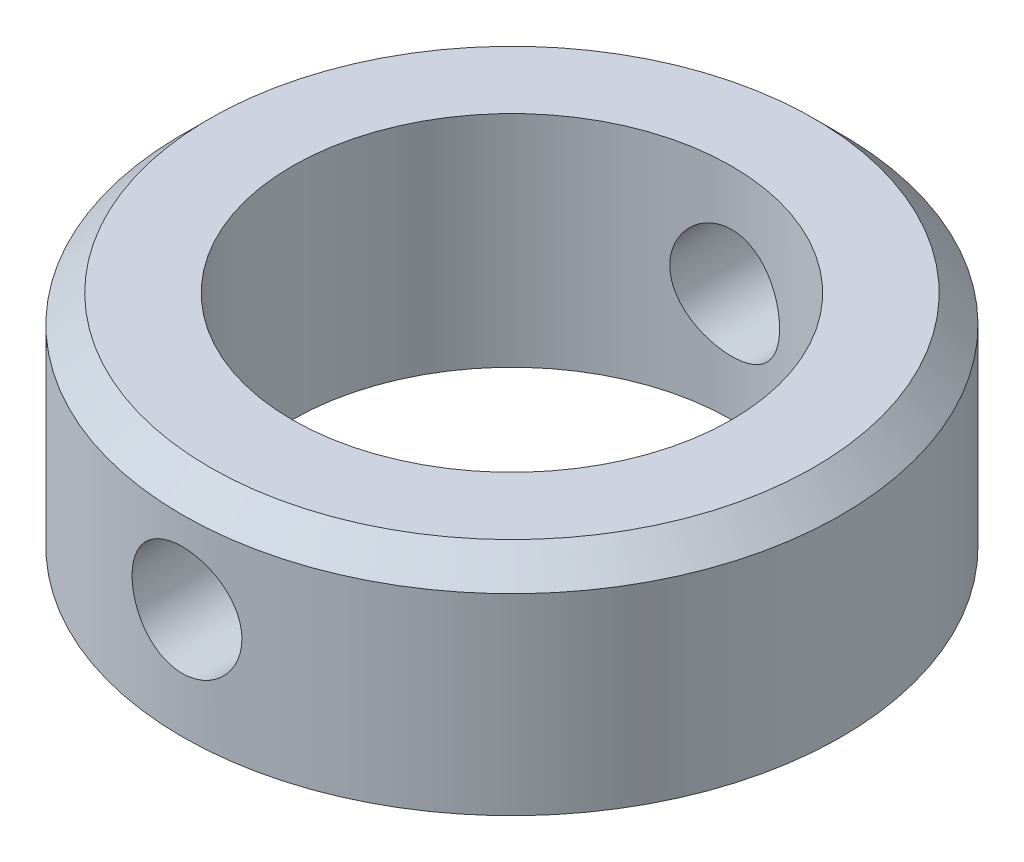
ISO-10303-21;
HEADER;
FILE_DESCRIPTION(('STEP AP214'),'2;1');
FILE_NAME('part.step','',(''),(''),'','','');
FILE_SCHEMA(('AUTOMOTIVE_DESIGN { 1 0 10303 214 1 1 1 1 }'));
ENDSEC;
DATA;
#1=APPLICATION_CONTEXT('core data for automotive mechanical design processes');
#2=APPLICATION_PROTOCOL_DEFINITION('international standard','automotive_design',2000,#1);
#3=PRODUCT_CONTEXT('',#1,'mechanical');
#4=PRODUCT('Part','Part','',(#3));
#5=PRODUCT_RELATED_PRODUCT_CATEGORY('part','',(#4));
#6=PRODUCT_DEFINITION_FORMATION('','',#4);
#7=PRODUCT_DEFINITION_CONTEXT('part definition',#1,'design');
#8=PRODUCT_DEFINITION('design','',#6,#7);
#9=PRODUCT_DEFINITION_SHAPE('','',#8);
#10=(LENGTH_UNIT() NAMED_UNIT(*) SI_UNIT(.MILLI.,.METRE.));
#11=(NAMED_UNIT(*) PLANE_ANGLE_UNIT() SI_UNIT($,.RADIAN.));
#12=(NAMED_UNIT(*) SI_UNIT($,.STERADIAN.) SOLID_ANGLE_UNIT());
#13=UNCERTAINTY_MEASURE_WITH_UNIT(LENGTH_MEASURE(1.E-05),#10,'distance_accuracy_value','');
#14=(GEOMETRIC_REPRESENTATION_CONTEXT(3) GLOBAL_UNCERTAINTY_ASSIGNED_CONTEXT((#13)) GLOBAL_UNIT_ASSIGNED_CONTEXT((#10,
#11,#12)) REPRESENTATION_CONTEXT('',''));
#15=CARTESIAN_POINT('',(0.,0.,0.));
#16=DIRECTION('',(0.,0.,1.));
#17=DIRECTION('',(1.,0.,0.));
#18=AXIS2_PLACEMENT_3D('',#15,#16,#17);
#19=CARTESIAN_POINT('',(0.,4.,0.));
#20=DIRECTION('',(0.,1.,0.));
#21=DIRECTION('',(0.,0.,1.));
#22=AXIS2_PLACEMENT_3D('',#19,#20,#21);
#23=PLANE('',#22);
#24=CARTESIAN_POINT('',(0.,4.,0.));
#25=DIRECTION('',(0.,1.,0.));
#26=DIRECTION('',(0.,0.,1.));
#27=AXIS2_PLACEMENT_3D('',#24,#25,#26);
#28=CIRCLE('',#27,11.);
#29=CARTESIAN_POINT('',(0.,4.,11.));
#30=VERTEX_POINT('',#29);
#31=EDGE_CURVE('E50',#30,#30,#28,.T.);
#32=ORIENTED_EDGE('',*,*,#31,.T.);
#33=EDGE_LOOP('',(#32));
#34=FACE_BOUND('',#33,.T.);
#35=CARTESIAN_POINT('',(0.,4.,0.));
#36=DIRECTION('',(0.,1.,0.));
#37=DIRECTION('',(0.,0.,1.));
#38=AXIS2_PLACEMENT_3D('',#35,#36,#37);
#39=CIRCLE('',#38,8.);
#40=CARTESIAN_POINT('',(0.,4.,8.));
#41=VERTEX_POINT('',#40);
#42=EDGE_CURVE('E54',#41,#41,#39,.T.);
#43=ORIENTED_EDGE('',*,*,#42,.F.);
#44=EDGE_LOOP('',(#43));
#45=FACE_BOUND('',#44,.T.);
#46=ADVANCED_FACE('F39',(#34,#45),#23,.T.);
#47=CARTESIAN_POINT('',(0.,-4.,0.));
#48=DIRECTION('',(0.,1.,0.));
#49=DIRECTION('',(0.,0.,1.));
#50=AXIS2_PLACEMENT_3D('',#47,#48,#49);
#51=PLANE('',#50);
#52=CARTESIAN_POINT('',(0.,-4.,0.));
#53=DIRECTION('',(0.,1.,0.));
#54=DIRECTION('',(0.,0.,1.));
#55=AXIS2_PLACEMENT_3D('',#52,#53,#54);
#56=CIRCLE('',#55,12.);
#57=CARTESIAN_POINT('',(0.,-4.,12.));
#58=VERTEX_POINT('',#57);
#59=EDGE_CURVE('E51',#58,#58,#56,.T.);
#60=ORIENTED_EDGE('',*,*,#59,.F.);
#61=EDGE_LOOP('',(#60));
#62=FACE_BOUND('',#61,.T.);
#63=CARTESIAN_POINT('',(0.,-4.,0.));
#64=DIRECTION('',(0.,1.,0.));
#65=DIRECTION('',(0.,0.,1.));
#66=AXIS2_PLACEMENT_3D('',#63,#64,#65);
#67=CIRCLE('',#66,8.);
#68=CARTESIAN_POINT('',(0.,-4.,8.));
#69=VERTEX_POINT('',#68);
#70=EDGE_CURVE('E107',#69,#69,#67,.T.);
#71=ORIENTED_EDGE('',*,*,#70,.T.);
#72=EDGE_LOOP('',(#71));
#73=FACE_BOUND('',#72,.T.);
#74=ADVANCED_FACE('F100',(#62,#73),#51,.F.);
#75=CARTESIAN_POINT('',(0.,4.,0.));
#76=DIRECTION('',(0.,-1.,0.));
#77=DIRECTION('',(0.,0.,-1.));
#78=AXIS2_PLACEMENT_3D('',#75,#76,#77);
#79=CYLINDRICAL_SURFACE('',#78,12.);
#80=CARTESIAN_POINT('',(0.,2.99999999999999,0.));
#81=DIRECTION('',(0.,1.,0.));
#82=DIRECTION('',(0.,0.,1.));
#83=AXIS2_PLACEMENT_3D('',#80,#81,#82);
#84=CIRCLE('',#83,12.);
#85=CARTESIAN_POINT('',(0.,2.99999999999999,12.));
#86=VERTEX_POINT('',#85);
#87=EDGE_CURVE('E10',#86,#86,#84,.F.);
#88=ORIENTED_EDGE('',*,*,#87,.T.);
#89=EDGE_LOOP('',(#88));
#90=FACE_BOUND('',#89,.T.);
#91=CARTESIAN_POINT('',(0.,2.,-12.));
#92=CARTESIAN_POINT('',(-0.111512723966572,1.99999552884175,-11.9999980893506));
#93=CARTESIAN_POINT('',(-0.223086305471057,1.99064218002486,-11.9984294233043));
#94=CARTESIAN_POINT('',(-0.443104177338434,1.95349147298774,-11.9923227595311));
#95=CARTESIAN_POINT('',(-0.551545494367397,1.92567715447072,-11.9877820313911));
#96=CARTESIAN_POINT('',(-0.762083797770115,1.8524676411258,-11.9762405458916));
#97=CARTESIAN_POINT('',(-0.86418589474552,1.80708682748754,-11.9692418012735));
#98=CARTESIAN_POINT('',(-1.05931347358236,1.70007016635808,-11.9535538166566));
#99=CARTESIAN_POINT('',(-1.15233999190287,1.6384361780136,-11.9448647700355));
#100=CARTESIAN_POINT('',(-1.32757809143334,1.50003593294363,-11.9266665396665));
#101=CARTESIAN_POINT('',(-1.40969032282797,1.4231447082911,-11.9171509745189));
#102=CARTESIAN_POINT('',(-1.55991079892794,1.25668162522175,-11.8984210150139));
#103=CARTESIAN_POINT('',(-1.62801815951278,1.16710896683471,-11.8892066397013));
#104=CARTESIAN_POINT('',(-1.74869370048411,0.977143227042356,-11.8720605260782));
#105=CARTESIAN_POINT('',(-1.8011636422888,0.876686930556196,-11.8641370327331));
#106=CARTESIAN_POINT('',(-1.88844669232898,0.6682323485595,-11.8505583183574));
#107=CARTESIAN_POINT('',(-1.92326099325249,0.560234573057895,-11.8449029441145));
#108=CARTESIAN_POINT('',(-1.97393150222785,0.340815780114769,-11.836564294742));
#109=CARTESIAN_POINT('',(-1.98995922330832,0.229435410798887,-11.8338541478856));
#110=CARTESIAN_POINT('',(-2.0031333802319,0.00553577849322356,-11.8316315114932));
#111=CARTESIAN_POINT('',(-2.0002811523112,-0.106983403333839,-11.8321187956577));
#112=CARTESIAN_POINT('',(-1.97591607871692,-0.328742289020358,-11.8362114309084));
#113=CARTESIAN_POINT('',(-1.95459590551182,-0.438003842836186,-11.8397845865513));
#114=CARTESIAN_POINT('',(-1.89420251232276,-0.651377054263306,-11.8495959616881));
#115=CARTESIAN_POINT('',(-1.85512868345579,-0.755488535110836,-11.8558342725862));
#116=CARTESIAN_POINT('',(-1.76014179687513,-0.956183058752735,-11.8703078346728));
#117=CARTESIAN_POINT('',(-1.70414873110377,-1.05272752486498,-11.8785525368586));
#118=CARTESIAN_POINT('',(-1.57696961404595,-1.23512352043071,-11.8961033473201));
#119=CARTESIAN_POINT('',(-1.50578233652343,-1.32097418596394,-11.9054095412343));
#120=CARTESIAN_POINT('',(-1.34918576972724,-1.48066086864588,-11.9241762230383));
#121=CARTESIAN_POINT('',(-1.2636111710985,-1.55433481483207,-11.9336371938532));
#122=CARTESIAN_POINT('',(-1.08122819918532,-1.68630221013227,-11.9515408111738));
#123=CARTESIAN_POINT('',(-0.984419753525138,-1.74459556014658,-11.959983451118));
#124=CARTESIAN_POINT('',(-0.78216473293337,-1.84416178170903,-11.9749111431433));
#125=CARTESIAN_POINT('',(-0.67671098045173,-1.885420335465,-11.9813945472596));
#126=CARTESIAN_POINT('',(-0.460238676482186,-1.94959537219678,-11.9916600241013));
#127=CARTESIAN_POINT('',(-0.349220591343575,-1.97251338957897,-11.9954423228038));
#128=CARTESIAN_POINT('',(-0.1261679210413,-1.99913708676891,-11.9998490387415));
#129=CARTESIAN_POINT('',(-0.0141605897208095,-2.00306525744449,-12.0005100241023));
#130=CARTESIAN_POINT('',(0.20891181831191,-1.9921909244575,-11.9986997953694));
#131=CARTESIAN_POINT('',(0.31997693111363,-1.97738914149301,-11.9962287017929));
#132=CARTESIAN_POINT('',(0.53732494043741,-1.92966012053162,-11.9884546155056));
#133=CARTESIAN_POINT('',(0.643632694708303,-1.8968430332879,-11.9831688384105));
#134=CARTESIAN_POINT('',(0.849237507888353,-1.81413238544037,-11.9703557156429));
#135=CARTESIAN_POINT('',(0.948534172727774,-1.76423786589178,-11.9628282440962));
#136=CARTESIAN_POINT('',(1.13826455157517,-1.64827910024257,-11.9462761304193));
#137=CARTESIAN_POINT('',(1.22861220074972,-1.5820758750662,-11.9372388470962));
#138=CARTESIAN_POINT('',(1.39699486840215,-1.43557014769195,-11.9187077391352));
#139=CARTESIAN_POINT('',(1.47502899175727,-1.35526662137867,-11.9092138813724));
#140=CARTESIAN_POINT('',(1.6173942237264,-1.18184196154286,-11.8907214018868));
#141=CARTESIAN_POINT('',(1.68157500889097,-1.08859666758847,-11.8817289290968));
#142=CARTESIAN_POINT('',(1.79336184823599,-0.89251762468917,-11.8653722382231));
#143=CARTESIAN_POINT('',(1.84096842781586,-0.789684179818004,-11.8580079685282));
#144=CARTESIAN_POINT('',(1.91803066517852,-0.577768213750295,-11.8457876295816));
#145=CARTESIAN_POINT('',(1.94756114603836,-0.46871352397561,-11.8409212344885));
#146=CARTESIAN_POINT('',(1.98786836302262,-0.247103896622591,-11.8342217346821));
#147=CARTESIAN_POINT('',(1.99864672955693,-0.134549264214359,-11.8323883662618));
#148=CARTESIAN_POINT('',(2.00109829283788,0.0893641327699265,-11.8319738646721));
#149=CARTESIAN_POINT('',(1.99300810890015,0.20072030286023,-11.8333524520452));
#150=CARTESIAN_POINT('',(1.95846387116548,0.420463398440611,-11.8391182516298));
#151=CARTESIAN_POINT('',(1.93200987688998,0.528850333553497,-11.8435054540897));
#152=CARTESIAN_POINT('',(1.86157959167592,0.73948674983409,-11.8547788502538));
#153=CARTESIAN_POINT('',(1.81762367248035,0.841743208044819,-11.8616621377574));
#154=CARTESIAN_POINT('',(1.71346160313273,1.03746853535588,-11.8771549513777));
#155=CARTESIAN_POINT('',(1.65325464699885,1.13093696829771,-11.8857645631072));
#156=CARTESIAN_POINT('',(1.51745510749772,1.3076284664862,-11.903867632365));
#157=CARTESIAN_POINT('',(1.44168845087492,1.39071681336022,-11.9133703646104));
#158=CARTESIAN_POINT('',(1.27728722510418,1.54308128357995,-11.9321149788867));
#159=CARTESIAN_POINT('',(1.18864969033011,1.61235421491054,-11.9413568002124));
#160=CARTESIAN_POINT('',(1.00029533571223,1.73555861455996,-11.9586122371378));
#161=CARTESIAN_POINT('',(0.900506230026255,1.78938083145036,-11.9666169300248));
#162=CARTESIAN_POINT('',(0.693210455503185,1.87941558768794,-11.9804093408142));
#163=CARTESIAN_POINT('',(0.585711595864008,1.91564566486376,-11.9861992654199));
#164=CARTESIAN_POINT('',(0.398162648036321,1.96160421930133,-11.9936463266636));
#165=CARTESIAN_POINT('',(0.319247064238758,1.97597957569277,-11.9960162181869));
#166=CARTESIAN_POINT('',(0.160231448255847,1.9951789902758,-11.999193727889));
#167=CARTESIAN_POINT('',(0.0801314364867953,2.00000321290989,-12.0000013729651));
#168=CARTESIAN_POINT('',(0.,2.,-12.));
#169=B_SPLINE_CURVE_WITH_KNOTS('',3,(#91,#92,#93,#94,#95,#96,#97,#98,#99,#100,#101,#102,#103,
#104,#105,#106,#107,#108,#109,#110,#111,#112,#113,#114,#115,#116,#117,#118,#119,#120,#121,#122,
#123,#124,#125,#126,#127,#128,#129,#130,#131,#132,#133,#134,#135,#136,#137,#138,#139,#140,#141,
#142,#143,#144,#145,#146,#147,#148,#149,#150,#151,#152,#153,#154,#155,#156,#157,#158,#159,#160,
#161,#162,#163,#164,#165,#166,#167,#168),.UNSPECIFIED.,.T.,.F.,(4,2,2,2,2,2,2,2,2,2,2,2,2,2,2,2,
2,2,2,2,2,2,2,2,2,2,2,2,2,2,2,2,2,2,2,2,2,2,4),(0.,0.334245267950808,0.668798036556336,
1.00307749362022,1.33731873013983,1.67441992849866,2.01154240135885,2.35074016659072,
2.68991501500945,3.02596861682739,3.36199843456709,3.69456417408327,4.02714132020305,
4.36131645306046,4.69551856544459,5.03386215929061,5.37220793308678,5.71083751132722,
6.04943875616919,6.38406306793118,6.71867450428688,7.05126245605132,7.38386908660853,
7.71941460501619,8.05498450443426,8.39403057606095,8.73306589900754,9.07068817873417,
9.40828110229294,9.7416632761816,10.0750443695051,10.4080385458098,10.7410492402347,
11.0780110735471,11.4150506710318,11.7544178528576,12.0934460170406,12.3336339853121,
12.5738178182157),.UNSPECIFIED.);
#170=CARTESIAN_POINT('',(0.,2.,-12.));
#171=VERTEX_POINT('',#170);
#172=EDGE_CURVE('E86',#171,#171,#169,.T.);
#173=ORIENTED_EDGE('',*,*,#172,.T.);
#174=EDGE_LOOP('',(#173));
#175=FACE_BOUND('',#174,.T.);
#176=CARTESIAN_POINT('',(2.,0.,11.8321595661992));
#177=CARTESIAN_POINT('',(1.99999551873586,-0.111500598529449,11.8321615789328));
#178=CARTESIAN_POINT('',(1.99064413522263,-0.223062084857177,11.8337527390819));
#179=CARTESIAN_POINT('',(1.9535019424531,-0.443054834610535,11.8399396576003));
#180=CARTESIAN_POINT('',(1.92569412824689,-0.551483115006451,11.844538186771));
#181=CARTESIAN_POINT('',(1.8525036349364,-0.761993826673285,11.8562048749385));
#182=CARTESIAN_POINT('',(1.80713564394559,-0.864081478929796,11.8632709694721));
#183=CARTESIAN_POINT('',(1.70014919751157,-1.05918476377422,11.8790741768183));
#184=CARTESIAN_POINT('',(1.63853257080106,-1.15220141566186,11.8878111015538));
#185=CARTESIAN_POINT('',(1.50015002157324,-1.32745027979565,11.906067769247));
#186=CARTESIAN_POINT('',(1.42325523914587,-1.40958010510897,11.9155937386236));
#187=CARTESIAN_POINT('',(1.25677760375622,-1.55983464548945,11.9342998453486));
#188=CARTESIAN_POINT('',(1.16719399931998,-1.62795853049233,11.9434799621739));
#189=CARTESIAN_POINT('',(0.977218295958686,-1.74865165377542,11.9605258958617));
#190=CARTESIAN_POINT('',(0.876764865165368,-1.80112560618544,11.9683835394587));
#191=CARTESIAN_POINT('',(0.668316497379096,-1.88841685642444,11.9818298956567));
#192=CARTESIAN_POINT('',(0.560322051262552,-1.9232353023079,11.9874187557813));
#193=CARTESIAN_POINT('',(0.340914981075395,-1.97391402798712,11.9956538777952));
#194=CARTESIAN_POINT('',(0.229543109343418,-1.98994633280375,11.9983268248873));
#195=CARTESIAN_POINT('',(0.00566022842063891,-2.00313260332208,12.0005206347422));
#196=CARTESIAN_POINT('',(-0.106850702823118,-2.00028785219779,12.0000417117545));
#197=CARTESIAN_POINT('',(-0.328641748063099,-1.97593491877743,11.9960068674511));
#198=CARTESIAN_POINT('',(-0.437942824560112,-1.95461186927268,11.9924814695392));
#199=CARTESIAN_POINT('',(-0.651393583689432,-1.89419914060281,11.9827838301731));
#200=CARTESIAN_POINT('',(-0.755543109321202,-1.8551089203284,11.9766115081057));
#201=CARTESIAN_POINT('',(-0.956284918226117,-1.76008748774775,11.9622615880957));
#202=CARTESIAN_POINT('',(-1.05284041841524,-1.70407999033405,11.954074938615));
#203=CARTESIAN_POINT('',(-1.23525242387731,-1.57686974189196,11.936605904572));
#204=CARTESIAN_POINT('',(-1.3211080623327,-1.50566576103135,11.9273234313531));
#205=CARTESIAN_POINT('',(-1.48077701875733,-1.34905695470456,11.9085621458608));
#206=CARTESIAN_POINT('',(-1.55443160180257,-1.26349032407921,11.8990823178483));
#207=CARTESIAN_POINT('',(-1.68636367075845,-1.08113032782735,11.8811036782784));
#208=CARTESIAN_POINT('',(-1.74464101482593,-0.984336858653745,11.8726048757706));
#209=CARTESIAN_POINT('',(-1.84419554759063,-0.782086686498017,11.8575500364945));
#210=CARTESIAN_POINT('',(-1.88545362182339,-0.676620401526329,11.8509961864208));
#211=CARTESIAN_POINT('',(-1.94962389665249,-0.460120742153966,11.840609509519));
#212=CARTESIAN_POINT('',(-1.97253771261436,-0.349087858854063,11.8367764431066));
#213=CARTESIAN_POINT('',(-1.99914550790341,-0.126027075070297,11.8323116753769));
#214=CARTESIAN_POINT('',(-2.00306576632995,-0.0140268962383203,11.8316422860694));
#215=CARTESIAN_POINT('',(-1.99217816214597,0.209029337352654,11.8334802782589));
#216=CARTESIAN_POINT('',(-1.97737102289973,0.320085428411176,11.8359875370548));
#217=CARTESIAN_POINT('',(-1.92964186794248,0.537382207352685,11.8438614996401));
#218=CARTESIAN_POINT('',(-1.89683503251711,0.643648911902407,11.8492100153468));
#219=CARTESIAN_POINT('',(-1.81415855215382,0.849176133023587,11.862148584044));
#220=CARTESIAN_POINT('',(-1.76428788648075,0.948436230040719,11.8697387711246));
#221=CARTESIAN_POINT('',(-1.64836533858338,1.13813967552489,11.8863930271791));
#222=CARTESIAN_POINT('',(-1.58216845132749,1.22849325820484,11.8954700448028));
#223=CARTESIAN_POINT('',(-1.43567157256639,1.396890826156,11.9140373334389));
#224=CARTESIAN_POINT('',(-1.35537058910724,1.47493394488779,11.9235276334827));
#225=CARTESIAN_POINT('',(-1.18194245626305,1.61732151418296,11.9419713769461));
#226=CARTESIAN_POINT('',(-1.08869060270896,1.68151506102763,11.9509182107574));
#227=CARTESIAN_POINT('',(-0.892594758359462,1.7933242616039,11.9671608994635));
#228=CARTESIAN_POINT('',(-0.789751077976503,1.84094045157908,11.9744568077598));
#229=CARTESIAN_POINT('',(-0.577839241201065,1.91800846716389,11.9865468653567));
#230=CARTESIAN_POINT('',(-0.468800450082091,1.94753926058794,11.9913518765409));
#231=CARTESIAN_POINT('',(-0.247224587899371,1.98785247917106,11.9979646653543));
#232=CARTESIAN_POINT('',(-0.134687805457299,1.99863644698588,11.9997726896015));
#233=CARTESIAN_POINT('',(0.0892330206189387,2.00110550584976,12.0001843031025));
#234=CARTESIAN_POINT('',(0.200614528482129,1.99302020315287,11.9988264161935));
#235=CARTESIAN_POINT('',(0.420409579451761,1.95847686218446,11.9931374270987));
#236=CARTESIAN_POINT('',(0.528823139173981,1.93201892679226,11.9888063415615));
#237=CARTESIAN_POINT('',(0.739517156734828,1.86156946756508,11.9776559106192));
#238=CARTESIAN_POINT('',(0.841804297723055,1.81759746543196,11.970839336327));
#239=CARTESIAN_POINT('',(1.03758436238573,1.71339365101554,11.9554620550242));
#240=CARTESIAN_POINT('',(1.13107686889457,1.65316106795004,11.9469012653393));
#241=CARTESIAN_POINT('',(1.30777035642111,1.5173319260316,11.9288610369313));
#242=CARTESIAN_POINT('',(1.3908411444822,1.441567236199,11.919372196329));
#243=CARTESIAN_POINT('',(1.54317110076073,1.27717735367695,11.900610426515));
#244=CARTESIAN_POINT('',(1.61242702936952,1.18854915286998,11.8913375483961));
#245=CARTESIAN_POINT('',(1.73561141672869,1.00020374200831,11.8739867482713));
#246=CARTESIAN_POINT('',(1.78942799124616,0.900412528187613,11.8659177427663));
#247=CARTESIAN_POINT('',(1.87945162912342,0.693112611329485,11.8519936807305));
#248=CARTESIAN_POINT('',(1.91567628417846,0.58561174185811,11.846136413799));
#249=CARTESIAN_POINT('',(1.96162084250194,0.398076984410094,11.8385979588519));
#250=CARTESIAN_POINT('',(1.97598993413711,0.319178553629915,11.8361969873557));
#251=CARTESIAN_POINT('',(1.99518103614505,0.160197212130451,11.8329770823046));
#252=CARTESIAN_POINT('',(2.00000321983422,0.0801143229406412,11.8321581200295));
#253=CARTESIAN_POINT('',(2.,0.,11.8321595661992));
#254=B_SPLINE_CURVE_WITH_KNOTS('',3,(#176,#177,#178,#179,#180,#181,#182,#183,#184,#185,#186,
#187,#188,#189,#190,#191,#192,#193,#194,#195,#196,#197,#198,#199,#200,#201,#202,#203,#204,#205,
#206,#207,#208,#209,#210,#211,#212,#213,#214,#215,#216,#217,#218,#219,#220,#221,#222,#223,#224,
#225,#226,#227,#228,#229,#230,#231,#232,#233,#234,#235,#236,#237,#238,#239,#240,#241,#242,#243,
#244,#245,#246,#247,#248,#249,#250,#251,#252,#253),.UNSPECIFIED.,.T.,.F.,(4,2,2,2,2,2,2,2,2,2,2,
2,2,2,2,2,2,2,2,2,2,2,2,2,2,2,2,2,2,2,2,2,2,2,2,2,2,2,4),(0.,0.334208831142192,
0.668726015970375,1.00296399830015,1.33716437924219,1.67431327324572,2.01148214267557,
2.35066384089148,2.6898234808889,3.02585253978052,3.36185875722153,3.69453696931735,
4.02722531399626,4.3614368331154,4.69567540981411,5.03396898769698,5.37226568596815,
5.71094129998882,6.04958708750461,6.38418833936328,6.71877666731181,7.05124851708393,
7.38374025834859,7.71929874210161,8.05488083544551,8.39395290428305,8.73301400381358,
9.07058387534116,9.4081259672988,9.74158221012733,10.0750365857506,10.4081203186597,
10.7412198431387,11.078135979706,11.4151310310545,11.7545098209466,12.0935485339556,
12.3336853643501,12.5738178352145),.UNSPECIFIED.);
#255=CARTESIAN_POINT('',(2.,0.,11.8321595661992));
#256=VERTEX_POINT('',#255);
#257=EDGE_CURVE('E66',#256,#256,#254,.T.);
#258=ORIENTED_EDGE('',*,*,#257,.T.);
#259=EDGE_LOOP('',(#258));
#260=FACE_BOUND('',#259,.T.);
#261=ORIENTED_EDGE('',*,*,#59,.T.);
#262=EDGE_LOOP('',(#261));
#263=FACE_BOUND('',#262,.T.);
#264=ADVANCED_FACE('F91',(#90,#175,#260,#263),#79,.T.);
#265=CARTESIAN_POINT('',(0.,4.,0.));
#266=DIRECTION('',(0.,-1.,0.));
#267=DIRECTION('',(0.,0.,-1.));
#268=AXIS2_PLACEMENT_3D('',#265,#266,#267);
#269=CYLINDRICAL_SURFACE('',#268,8.);
#270=CARTESIAN_POINT('',(0.,2.,-8.));
#271=CARTESIAN_POINT('',(-0.110501451559641,1.99999689901579,-7.9999981315735));
#272=CARTESIAN_POINT('',(-0.221037543774351,1.99081126563495,-7.99768770842435));
#273=CARTESIAN_POINT('',(-0.438941765027377,1.95436646492399,-7.98869485106526));
#274=CARTESIAN_POINT('',(-0.546308062494319,1.92709705394953,-7.98200993893301));
#275=CARTESIAN_POINT('',(-0.754694496243435,1.85541432871722,-7.96500835109376));
#276=CARTESIAN_POINT('',(-0.855722084573335,1.81102160171297,-7.95469603789411));
#277=CARTESIAN_POINT('',(-1.04889617587257,1.70642481327354,-7.93153791743495));
#278=CARTESIAN_POINT('',(-1.14104237913168,1.64622021850804,-7.91869202472209));
#279=CARTESIAN_POINT('',(-1.31573590306789,1.51039894712776,-7.89156551455591));
#280=CARTESIAN_POINT('',(-1.39807425341474,1.43451790005459,-7.87726276197502));
#281=CARTESIAN_POINT('',(-1.54899856960443,1.27006372678795,-7.84898160157248));
#282=CARTESIAN_POINT('',(-1.61758298259892,1.18148916940409,-7.83500323053157));
#283=CARTESIAN_POINT('',(-1.74003539039863,0.992539697684013,-7.80873034264225));
#284=CARTESIAN_POINT('',(-1.79366962123352,0.892009025588362,-7.79646392619748));
#285=CARTESIAN_POINT('',(-1.88319587806766,0.68300211778662,-7.77532659757355));
#286=CARTESIAN_POINT('',(-1.91909074058685,0.574527155557314,-7.76645514259225));
#287=CARTESIAN_POINT('',(-1.97140644907302,0.355008669064455,-7.7533396892843));
#288=CARTESIAN_POINT('',(-1.98820302444274,0.244060138616012,-7.74900654662681));
#289=CARTESIAN_POINT('',(-2.00301570008854,0.0208419080008738,-7.74519149946122));
#290=CARTESIAN_POINT('',(-2.00103485575748,-0.0914275742561817,-7.74570880570571));
#291=CARTESIAN_POINT('',(-1.97864869951961,-0.311221076993803,-7.75145607355756));
#292=CARTESIAN_POINT('',(-1.95869112025418,-0.418794161953773,-7.75657150676392));
#293=CARTESIAN_POINT('',(-1.90163224920399,-0.629014734548077,-7.77075612894759));
#294=CARTESIAN_POINT('',(-1.86452973609252,-0.731661870705227,-7.77982559958985));
#295=CARTESIAN_POINT('',(-1.77385263724958,-0.930317355002839,-7.80100151874212));
#296=CARTESIAN_POINT('',(-1.72011555631056,-1.02624822905276,-7.81313769959755));
#297=CARTESIAN_POINT('',(-1.59780836801993,-1.20789161300909,-7.83906281127988));
#298=CARTESIAN_POINT('',(-1.52923566507845,-1.29360233075633,-7.85285203112837));
#299=CARTESIAN_POINT('',(-1.37688456624163,-1.45493815425921,-7.88101174053188));
#300=CARTESIAN_POINT('',(-1.29272834422115,-1.53020598674847,-7.89538759304001));
#301=CARTESIAN_POINT('',(-1.11281589000493,-1.6656283232852,-7.92274620771675));
#302=CARTESIAN_POINT('',(-1.01705930361059,-1.72578236568475,-7.93572892732543));
#303=CARTESIAN_POINT('',(-0.816154518241856,-1.82940078163251,-7.9589030945892));
#304=CARTESIAN_POINT('',(-0.710975190944832,-1.87280712033924,-7.96908480170303));
#305=CARTESIAN_POINT('',(-0.494501344190511,-1.94122307427943,-7.98543889321888));
#306=CARTESIAN_POINT('',(-0.383207998867313,-1.96623620855752,-7.99161204452374));
#307=CARTESIAN_POINT('',(-0.160719960520037,-1.99661008741178,-7.999139990285));
#308=CARTESIAN_POINT('',(-0.0495956266509474,-2.0024573681004,-8.00061404677705));
#309=CARTESIAN_POINT('',(0.172043833068676,-1.99566799725935,-7.99891739752601));
#310=CARTESIAN_POINT('',(0.282559012859459,-1.98303300960116,-7.99574710989128));
#311=CARTESIAN_POINT('',(0.498152358368655,-1.94003878881149,-7.98519441503143));
#312=CARTESIAN_POINT('',(0.603286825291672,-1.90994498203068,-7.97787512247748));
#313=CARTESIAN_POINT('',(0.807009723270014,-1.83319055462874,-7.95984942178845));
#314=CARTESIAN_POINT('',(0.905597492043512,-1.78652826091577,-7.94914267159856));
#315=CARTESIAN_POINT('',(1.0953641792398,-1.6770184948337,-7.92524410568414));
#316=CARTESIAN_POINT('',(1.18638058911444,-1.61389851680432,-7.91201156489243));
#317=CARTESIAN_POINT('',(1.35670215152433,-1.47361345493737,-7.88459345583226));
#318=CARTESIAN_POINT('',(1.43600527863068,-1.39644594717746,-7.87040772335606));
#319=CARTESIAN_POINT('',(1.58265409076364,-1.22799738554072,-7.84225275947695));
#320=CARTESIAN_POINT('',(1.64965849016271,-1.13641639599677,-7.82829738916375));
#321=CARTESIAN_POINT('',(1.7673476786836,-0.943023154045711,-7.80257171169652));
#322=CARTESIAN_POINT('',(1.81803319221058,-0.841211356053663,-7.79080130756035));
#323=CARTESIAN_POINT('',(1.90126856081239,-0.630792370115897,-7.77090792979554));
#324=CARTESIAN_POINT('',(1.93392586220542,-0.522229828874657,-7.76276340389207));
#325=CARTESIAN_POINT('',(1.98046087993837,-0.300920482814524,-7.75102325453578));
#326=CARTESIAN_POINT('',(1.99434270330488,-0.188174598623348,-7.74742663626581));
#327=CARTESIAN_POINT('',(2.00271812044533,0.0348280318069358,-7.74526534938609));
#328=CARTESIAN_POINT('',(1.99775719704016,0.145063246832973,-7.74655910304352));
#329=CARTESIAN_POINT('',(1.96983637108382,0.363071851557307,-7.7537054534379));
#330=CARTESIAN_POINT('',(1.94687683024903,0.470845290684866,-7.75955795855809));
#331=CARTESIAN_POINT('',(1.88390842592373,0.680277945420543,-7.77508347576963));
#332=CARTESIAN_POINT('',(1.84400187290717,0.781969740320276,-7.78473353648412));
#333=CARTESIAN_POINT('',(1.74835321814009,0.977287176951584,-7.80677007633105));
#334=CARTESIAN_POINT('',(1.69260892004559,1.07091169758255,-7.81915693494364));
#335=CARTESIAN_POINT('',(1.56515699818285,1.25007283866936,-7.84567512351349));
#336=CARTESIAN_POINT('',(1.49307088388301,1.33533476456528,-7.85984353109009));
#337=CARTESIAN_POINT('',(1.33571916158632,1.49272939306054,-7.88810702995047));
#338=CARTESIAN_POINT('',(1.2504504283482,1.56485897348396,-7.90220210302746));
#339=CARTESIAN_POINT('',(1.06729011560345,1.69521507808614,-7.9290354086355));
#340=CARTESIAN_POINT('',(0.96919789642185,1.7531661515621,-7.94174444487824));
#341=CARTESIAN_POINT('',(0.76435474601397,1.85166328392071,-7.96406566633491));
#342=CARTESIAN_POINT('',(0.657610084582321,1.89222181419805,-7.97368006933042));
#343=CARTESIAN_POINT('',(0.459213670991297,1.94876244043954,-7.98730746087389));
#344=CARTESIAN_POINT('',(0.368506894544092,1.96793499073791,-7.9920344673692));
#345=CARTESIAN_POINT('',(0.185208095381711,1.99355459149592,-7.99838140309264));
#346=CARTESIAN_POINT('',(0.0926162149901553,2.00000259907373,-8.00000156601192));
#347=CARTESIAN_POINT('',(0.,2.,-8.));
#348=B_SPLINE_CURVE_WITH_KNOTS('',3,(#270,#271,#272,#273,#274,#275,#276,#277,#278,#279,#280,
#281,#282,#283,#284,#285,#286,#287,#288,#289,#290,#291,#292,#293,#294,#295,#296,#297,#298,#299,
#300,#301,#302,#303,#304,#305,#306,#307,#308,#309,#310,#311,#312,#313,#314,#315,#316,#317,#318,
#319,#320,#321,#322,#323,#324,#325,#326,#327,#328,#329,#330,#331,#332,#333,#334,#335,#336,#337,
#338,#339,#340,#341,#342,#343,#344,#345,#346,#347),.UNSPECIFIED.,.T.,.F.,(4,2,2,2,2,2,2,2,2,2,2,
2,2,2,2,2,2,2,2,2,2,2,2,2,2,2,2,2,2,2,2,2,2,2,2,2,2,2,4),(0.,0.331164949962519,
0.662517650351866,0.99347320304814,1.32443992022577,1.66152580582852,1.99864972773416,
2.34078196727742,2.68285948225824,3.01808393468093,3.3532538415469,3.68029996013785,
4.00736937959145,4.337740371696,4.66816921119311,5.00802001296453,5.34788119415424,
5.6889097201658,6.02987298255951,6.36211078603462,6.69431868154751,7.02160366023144,
7.34892169767481,7.68204783424897,8.01523150681786,8.35659345610395,8.69794025003771,
9.03723006156476,9.37644564340971,9.70591707202577,10.0353818794581,10.3628853408369,
10.6904342418696,11.0265276855097,11.3627009303165,11.7049624733721,12.0469781843289,
12.3245632392729,12.6021274139515),.UNSPECIFIED.);
#349=CARTESIAN_POINT('',(0.,2.,-8.));
#350=VERTEX_POINT('',#349);
#351=EDGE_CURVE('E59',#350,#350,#348,.T.);
#352=ORIENTED_EDGE('',*,*,#351,.F.);
#353=EDGE_LOOP('',(#352));
#354=FACE_BOUND('',#353,.T.);
#355=CARTESIAN_POINT('',(2.,0.,7.74596669241483));
#356=CARTESIAN_POINT('',(1.99999686287446,-0.110440600741261,7.74596880070288));
#357=CARTESIAN_POINT('',(1.99082099639812,-0.220915918942817,7.74835444811678));
#358=CARTESIAN_POINT('',(1.95441850037103,-0.438694062538807,7.75761489594051));
#359=CARTESIAN_POINT('',(1.92718136539368,-0.545995003574548,7.76449230897304));
#360=CARTESIAN_POINT('',(1.85559295970563,-0.754242830549745,7.7819097967692));
#361=CARTESIAN_POINT('',(1.81126378228359,-0.855197724308566,7.79244514152366));
#362=CARTESIAN_POINT('',(1.70681691300911,-1.04824868203191,7.81598553623007));
#363=CARTESIAN_POINT('',(1.64669855084855,-1.14034436966417,7.82899069102791));
#364=CARTESIAN_POINT('',(1.51096674184951,-1.31508931620977,7.856325730845));
#365=CARTESIAN_POINT('',(1.43506951016324,-1.39751488028004,7.87067678098427));
#366=CARTESIAN_POINT('',(1.27054565128053,-1.54860911548827,7.89890300412235));
#367=CARTESIAN_POINT('',(1.18191783534425,-1.6172765004974,7.91277813253111));
#368=CARTESIAN_POINT('',(0.992916160863166,-1.73982037410502,7.93872332416466));
#369=CARTESIAN_POINT('',(0.892395660956098,-1.79347711052917,7.95076549920474));
#370=CARTESIAN_POINT('',(0.683410547434212,-1.88304771532247,7.97144649540787));
#371=CARTESIAN_POINT('',(0.574947108633554,-1.91896420153241,7.98008581867475));
#372=CARTESIAN_POINT('',(0.355487007003331,-1.97131826766287,7.99283807078544));
#373=CARTESIAN_POINT('',(0.244586175639182,-1.98813571546127,7.99703915075451));
#374=CARTESIAN_POINT('',(0.0214630554102167,-2.00300670342044,8.00074875285838));
#375=CARTESIAN_POINT('',(-0.0907590356304537,-2.00106301776768,8.00025796877363));
#376=CARTESIAN_POINT('',(-0.310704494344774,-1.97874011979988,7.99470475962828));
#377=CARTESIAN_POINT('',(-0.418472431202133,-1.95877093995692,7.98974401872699));
#378=CARTESIAN_POINT('',(-0.629076494827372,-1.9016229839612,7.97592669219883));
#379=CARTESIAN_POINT('',(-0.731912358740875,-1.86444329169807,7.96706989918753));
#380=CARTESIAN_POINT('',(-0.930813407003613,-1.77359794345035,7.94630007760717));
#381=CARTESIAN_POINT('',(-1.02680901953301,-1.7197863642706,7.93436015756043));
#382=CARTESIAN_POINT('',(-1.20855124468098,-1.59731545670699,7.90871923047719));
#383=CARTESIAN_POINT('',(-1.29429607017101,-1.5286535451515,7.89501791721992));
#384=CARTESIAN_POINT('',(-1.45554807016991,-1.3762330064141,7.86690971015616));
#385=CARTESIAN_POINT('',(-1.5307153581504,-1.29211608612178,7.85249375620734));
#386=CARTESIAN_POINT('',(-1.66595275192604,-1.1123200211678,7.82492034813365));
#387=CARTESIAN_POINT('',(-1.72602215209203,-1.0166403364072,7.81176295284776));
#388=CARTESIAN_POINT('',(-1.8295762580452,-0.815767972680827,7.78816397465319));
#389=CARTESIAN_POINT('',(-1.87297913394098,-0.710531415749444,7.77773586980577));
#390=CARTESIAN_POINT('',(-1.94137124127268,-0.493931625538839,7.76094912111966));
#391=CARTESIAN_POINT('',(-1.96636441310582,-0.382569708813491,7.75458960648175));
#392=CARTESIAN_POINT('',(-1.99666371093214,-0.160032398781503,7.74684284831313));
#393=CARTESIAN_POINT('',(-2.0024723791357,-0.048929765336297,7.74532871274919));
#394=CARTESIAN_POINT('',(-1.99561359241244,0.172657549262526,7.74709874784831));
#395=CARTESIAN_POINT('',(-1.98294783827904,0.283142286360992,7.75038247681013));
#396=CARTESIAN_POINT('',(-1.93994037115013,0.498491411963765,7.76125665563648));
#397=CARTESIAN_POINT('',(-1.9098912546254,0.603418181256674,7.768775761875));
#398=CARTESIAN_POINT('',(-1.8332944653365,0.806745166281345,7.7872057461677));
#399=CARTESIAN_POINT('',(-1.78674483817004,0.905144607244271,7.79811702598891));
#400=CARTESIAN_POINT('',(-1.67741653434925,1.09475302229388,7.8223690967461));
#401=CARTESIAN_POINT('',(-1.6143374030685,1.18578307203448,7.83575334885313));
#402=CARTESIAN_POINT('',(-1.47412058586891,1.35615069024108,7.86333666457373));
#403=CARTESIAN_POINT('',(-1.39698058961088,1.43548633332006,7.87753586182776));
#404=CARTESIAN_POINT('',(-1.22852544196945,1.58224883405676,7.90557922425285));
#405=CARTESIAN_POINT('',(-1.13690390506319,1.64932805003905,7.91940561649468));
#406=CARTESIAN_POINT('',(-0.943405365389352,1.76714869356099,7.94477773290987));
#407=CARTESIAN_POINT('',(-0.841528897915183,1.81789097328656,7.95632357603169));
#408=CARTESIAN_POINT('',(-0.631116403462182,1.90115682762235,7.9757609259065));
#409=CARTESIAN_POINT('',(-0.522634762055765,1.93381142750325,7.98367864017925));
#410=CARTESIAN_POINT('',(-0.301499520637615,1.98036826768673,7.99508234716634));
#411=CARTESIAN_POINT('',(-0.188846730082482,1.99427412699123,7.99856919514738));
#412=CARTESIAN_POINT('',(0.0341670528866456,2.00273517915108,8.00068338817612));
#413=CARTESIAN_POINT('',(0.144507653932043,1.99780341819082,7.99943957759977));
#414=CARTESIAN_POINT('',(0.362734992829501,1.9699043454113,7.99251792914887));
#415=CARTESIAN_POINT('',(0.470621803561857,1.94693756997366,7.98684022314338));
#416=CARTESIAN_POINT('',(0.680342071289547,1.88389556045828,7.97170865707778));
#417=CARTESIAN_POINT('',(0.782204989161725,1.84391309337124,7.96227529004785));
#418=CARTESIAN_POINT('',(0.977834106083247,1.74805884196086,7.94062577827316));
#419=CARTESIAN_POINT('',(1.07159928253127,1.69218505465903,7.92840928277515));
#420=CARTESIAN_POINT('',(1.25080385684661,1.56456953200773,7.90214499360574));
#421=CARTESIAN_POINT('',(1.33598997659667,1.49247971419234,7.88806033883329));
#422=CARTESIAN_POINT('',(1.49323004054701,1.33515429604531,7.85981298114379));
#423=CARTESIAN_POINT('',(1.56528065015318,1.24991536777767,7.84565025934604));
#424=CARTESIAN_POINT('',(1.69552405294366,1.06679717162108,7.81854951691005));
#425=CARTESIAN_POINT('',(1.75343323883276,0.968711753269492,7.80563927346578));
#426=CARTESIAN_POINT('',(1.85185379317094,0.763889020250361,7.78287910989656));
#427=CARTESIAN_POINT('',(1.8923778195043,0.657158067812307,7.77302696466428));
#428=CARTESIAN_POINT('',(1.94884505714201,0.458845976329679,7.75903817501475));
#429=CARTESIAN_POINT('',(1.96798634119376,0.368213671227727,7.75417326006998));
#430=CARTESIAN_POINT('',(1.99356458514354,0.185062262004625,7.7476367716524));
#431=CARTESIAN_POINT('',(2.0000026287435,0.0925433195111958,7.74596492578215));
#432=CARTESIAN_POINT('',(2.,0.,7.74596669241483));
#433=B_SPLINE_CURVE_WITH_KNOTS('',3,(#355,#356,#357,#358,#359,#360,#361,#362,#363,#364,#365,
#366,#367,#368,#369,#370,#371,#372,#373,#374,#375,#376,#377,#378,#379,#380,#381,#382,#383,#384,
#385,#386,#387,#388,#389,#390,#391,#392,#393,#394,#395,#396,#397,#398,#399,#400,#401,#402,#403,
#404,#405,#406,#407,#408,#409,#410,#411,#412,#413,#414,#415,#416,#417,#418,#419,#420,#421,#422,
#423,#424,#425,#426,#427,#428,#429,#430,#431,#432),.UNSPECIFIED.,.T.,.F.,(4,2,2,2,2,2,2,2,2,2,2,
2,2,2,2,2,2,2,2,2,2,2,2,2,2,2,2,2,2,2,2,2,2,2,2,2,2,2,4),(0.,0.330981953388909,
0.662156593142932,0.992904581732816,1.32366661404383,1.66099163354381,1.99834817183893,
2.34041197118336,2.68242527877674,3.01751000796277,3.35254518932816,3.68014610151157,
4.00776445379829,4.33834299403555,4.6689790837513,5.00856373257529,5.34816424959841,
5.68941145606722,6.03058560103638,6.36274859809373,6.69488101747041,7.02157924007365,
7.34831617137134,7.68146276687326,8.01466415108035,8.35620264772255,8.69772332575642,
9.03673658245543,9.3756843912723,9.70546756901965,10.0352409390158,10.3632390124777,
10.6912784459046,11.0271767726566,11.3631602525241,11.7054118182895,12.0474137709606,
12.3247826174462,12.6021278008238),.UNSPECIFIED.);
#434=CARTESIAN_POINT('',(2.,0.,7.74596669241483));
#435=VERTEX_POINT('',#434);
#436=EDGE_CURVE('E70',#435,#435,#433,.T.);
#437=ORIENTED_EDGE('',*,*,#436,.F.);
#438=EDGE_LOOP('',(#437));
#439=FACE_BOUND('',#438,.T.);
#440=ORIENTED_EDGE('',*,*,#42,.T.);
#441=EDGE_LOOP('',(#440));
#442=FACE_BOUND('',#441,.T.);
#443=ORIENTED_EDGE('',*,*,#70,.F.);
#444=EDGE_LOOP('',(#443));
#445=FACE_BOUND('',#444,.T.);
#446=ADVANCED_FACE('F72',(#354,#439,#442,#445),#269,.F.);
#447=CARTESIAN_POINT('',(0.,0.,-12.));
#448=DIRECTION('',(0.,0.,1.));
#449=DIRECTION('',(1.,0.,0.));
#450=AXIS2_PLACEMENT_3D('',#447,#448,#449);
#451=CYLINDRICAL_SURFACE('',#450,2.);
#452=ORIENTED_EDGE('',*,*,#436,.T.);
#453=EDGE_LOOP('',(#452));
#454=FACE_BOUND('',#453,.T.);
#455=ORIENTED_EDGE('',*,*,#257,.F.);
#456=EDGE_LOOP('',(#455));
#457=FACE_BOUND('',#456,.T.);
#458=ADVANCED_FACE('F80',(#454,#457),#451,.F.);
#459=ORIENTED_EDGE('',*,*,#351,.T.);
#460=EDGE_LOOP('',(#459));
#461=FACE_BOUND('',#460,.T.);
#462=ORIENTED_EDGE('',*,*,#172,.F.);
#463=EDGE_LOOP('',(#462));
#464=FACE_BOUND('',#463,.T.);
#465=ADVANCED_FACE('F74',(#461,#464),#451,.F.);
#466=CARTESIAN_POINT('',(0.,4.,0.));
#467=DIRECTION('',(0.,-1.,0.));
#468=DIRECTION('',(0.,0.,-1.));
#469=AXIS2_PLACEMENT_3D('',#466,#467,#468);
#470=CONICAL_SURFACE('',#469,11.,0.785398163397446);
#471=ORIENTED_EDGE('',*,*,#87,.F.);
#472=EDGE_LOOP('',(#471));
#473=FACE_BOUND('',#472,.T.);
#474=ORIENTED_EDGE('',*,*,#31,.F.);
#475=EDGE_LOOP('',(#474));
#476=FACE_BOUND('',#475,.T.);
#477=ADVANCED_FACE('F45',(#473,#476),#470,.T.);
#478=CLOSED_SHELL('',(#46,#74,#264,#446,#458,#465,#477));
#479=MANIFOLD_SOLID_BREP('B2',#478);
#480=ADVANCED_BREP_SHAPE_REPRESENTATION('',(#18,#479),#14);
#481=SHAPE_DEFINITION_REPRESENTATION(#9,#480);
ENDSEC;
END-ISO-10303-21;
